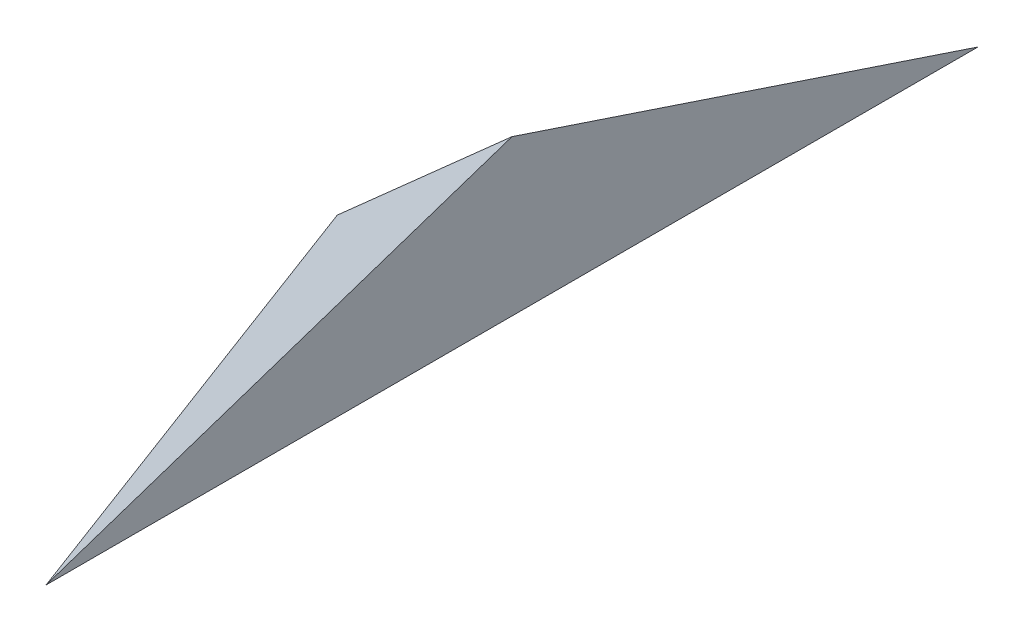
ISO-10303-21;
HEADER;
FILE_DESCRIPTION(('STEP AP214'),'2;1');
FILE_NAME('part.step','',(''),(''),'','','');
FILE_SCHEMA(('AUTOMOTIVE_DESIGN { 1 0 10303 214 1 1 1 1 }'));
ENDSEC;
DATA;
#1=APPLICATION_CONTEXT('core data for automotive mechanical design processes');
#2=APPLICATION_PROTOCOL_DEFINITION('international standard','automotive_design',2000,#1);
#3=PRODUCT_CONTEXT('',#1,'mechanical');
#4=PRODUCT('Part','Part','',(#3));
#5=PRODUCT_RELATED_PRODUCT_CATEGORY('part','',(#4));
#6=PRODUCT_DEFINITION_FORMATION('','',#4);
#7=PRODUCT_DEFINITION_CONTEXT('part definition',#1,'design');
#8=PRODUCT_DEFINITION('design','',#6,#7);
#9=PRODUCT_DEFINITION_SHAPE('','',#8);
#10=(LENGTH_UNIT() NAMED_UNIT(*) SI_UNIT(.MILLI.,.METRE.));
#11=(NAMED_UNIT(*) PLANE_ANGLE_UNIT() SI_UNIT($,.RADIAN.));
#12=(NAMED_UNIT(*) SI_UNIT($,.STERADIAN.) SOLID_ANGLE_UNIT());
#13=UNCERTAINTY_MEASURE_WITH_UNIT(LENGTH_MEASURE(1.E-05),#10,'distance_accuracy_value','');
#14=(GEOMETRIC_REPRESENTATION_CONTEXT(3) GLOBAL_UNCERTAINTY_ASSIGNED_CONTEXT((#13)) GLOBAL_UNIT_ASSIGNED_CONTEXT((#10,
#11,#12)) REPRESENTATION_CONTEXT('',''));
#15=CARTESIAN_POINT('',(0.,0.,0.));
#16=DIRECTION('',(0.,0.,1.));
#17=DIRECTION('',(1.,0.,0.));
#18=AXIS2_PLACEMENT_3D('',#15,#16,#17);
#19=CARTESIAN_POINT('',(0.,40.,0.));
#20=DIRECTION('',(-0.644658371220304,0.725240667622842,0.241746889207614));
#21=DIRECTION('',(-0.74740931868366,-0.66436383882992,0.));
#22=AXIS2_PLACEMENT_3D('',#19,#20,#21);
#23=PLANE('',#22);
#24=DIRECTION('',(-0.74740931868366,-0.66436383882992,0.));
#25=VECTOR('',#24,1.);
#26=CARTESIAN_POINT('',(0.,40.,0.));
#27=LINE('',#26,#25);
#28=CARTESIAN_POINT('',(0.,40.,0.));
#29=VERTEX_POINT('',#28);
#30=CARTESIAN_POINT('',(-45.,0.,0.));
#31=VERTEX_POINT('',#30);
#32=EDGE_CURVE('E121',#29,#31,#27,.T.);
#33=ORIENTED_EDGE('',*,*,#32,.T.);
#34=CARTESIAN_POINT('',(-45.,0.,0.));
#35=CARTESIAN_POINT('',(-30.,0.,40.));
#36=CARTESIAN_POINT('',(-15.,0.,80.));
#37=CARTESIAN_POINT('',(0.,0.,120.));
#38=B_SPLINE_CURVE_WITH_KNOTS('',3,(#34,#35,#36,#37),.UNSPECIFIED.,.F.,.F.,(4,4),(0.,1.),.UNSPECIFIED.);
#39=CARTESIAN_POINT('',(0.,0.,120.));
#40=VERTEX_POINT('',#39);
#41=EDGE_CURVE('E13',#31,#40,#38,.T.);
#42=ORIENTED_EDGE('',*,*,#41,.T.);
#43=CARTESIAN_POINT('',(0.,40.,0.));
#44=CARTESIAN_POINT('',(0.,26.6666666666667,40.));
#45=CARTESIAN_POINT('',(0.,13.3333333333333,80.));
#46=CARTESIAN_POINT('',(0.,0.,120.));
#47=B_SPLINE_CURVE_WITH_KNOTS('',3,(#43,#44,#45,#46),.UNSPECIFIED.,.F.,.F.,(4,4),(0.,1.),.UNSPECIFIED.);
#48=EDGE_CURVE('E127',#29,#40,#47,.T.);
#49=ORIENTED_EDGE('',*,*,#48,.F.);
#50=EDGE_LOOP('',(#33,#42,#49));
#51=FACE_BOUND('',#50,.T.);
#52=ADVANCED_FACE('F117',(#51),#23,.T.);
#53=CARTESIAN_POINT('',(0.,0.,0.));
#54=DIRECTION('',(1.,0.,0.));
#55=DIRECTION('',(0.,1.,0.));
#56=AXIS2_PLACEMENT_3D('',#53,#54,#55);
#57=PLANE('',#56);
#58=CARTESIAN_POINT('',(0.,0.,0.));
#59=CARTESIAN_POINT('',(0.,0.,40.));
#60=CARTESIAN_POINT('',(0.,0.,80.));
#61=CARTESIAN_POINT('',(0.,0.,120.));
#62=B_SPLINE_CURVE_WITH_KNOTS('',3,(#58,#59,#60,#61),.UNSPECIFIED.,.F.,.F.,(4,4),(0.,1.),.UNSPECIFIED.);
#63=CARTESIAN_POINT('',(0.,0.,0.));
#64=VERTEX_POINT('',#63);
#65=EDGE_CURVE('E160',#64,#40,#62,.T.);
#66=ORIENTED_EDGE('',*,*,#65,.F.);
#67=CARTESIAN_POINT('',(0.,0.,0.));
#68=CARTESIAN_POINT('',(0.,0.,-40.));
#69=CARTESIAN_POINT('',(0.,0.,-80.));
#70=CARTESIAN_POINT('',(0.,0.,-120.));
#71=B_SPLINE_CURVE_WITH_KNOTS('',3,(#67,#68,#69,#70),.UNSPECIFIED.,.F.,.F.,(4,4),(0.,1.),.UNSPECIFIED.);
#72=CARTESIAN_POINT('',(0.,0.,-120.));
#73=VERTEX_POINT('',#72);
#74=EDGE_CURVE('E141',#64,#73,#71,.T.);
#75=ORIENTED_EDGE('',*,*,#74,.T.);
#76=CARTESIAN_POINT('',(0.,40.,0.));
#77=CARTESIAN_POINT('',(0.,26.6666666666667,-40.));
#78=CARTESIAN_POINT('',(0.,13.3333333333333,-80.));
#79=CARTESIAN_POINT('',(0.,0.,-120.));
#80=B_SPLINE_CURVE_WITH_KNOTS('',3,(#76,#77,#78,#79),.UNSPECIFIED.,.F.,.F.,(4,4),(0.,1.),.UNSPECIFIED.);
#81=EDGE_CURVE('E155',#29,#73,#80,.T.);
#82=ORIENTED_EDGE('',*,*,#81,.F.);
#83=ORIENTED_EDGE('',*,*,#48,.T.);
#84=EDGE_LOOP('',(#66,#75,#82,#83));
#85=FACE_BOUND('',#84,.T.);
#86=ADVANCED_FACE('F200',(#85),#57,.T.);
#87=CARTESIAN_POINT('',(-45.,0.,0.));
#88=DIRECTION('',(0.,-1.,0.));
#89=DIRECTION('',(1.,0.,0.));
#90=AXIS2_PLACEMENT_3D('',#87,#88,#89);
#91=PLANE('',#90);
#92=ORIENTED_EDGE('',*,*,#41,.F.);
#93=CARTESIAN_POINT('',(-45.,0.,0.));
#94=CARTESIAN_POINT('',(-30.,0.,-40.));
#95=CARTESIAN_POINT('',(-15.,0.,-80.));
#96=CARTESIAN_POINT('',(0.,0.,-120.));
#97=B_SPLINE_CURVE_WITH_KNOTS('',3,(#93,#94,#95,#96),.UNSPECIFIED.,.F.,.F.,(4,4),(0.,1.),.UNSPECIFIED.);
#98=EDGE_CURVE('E151',#31,#73,#97,.T.);
#99=ORIENTED_EDGE('',*,*,#98,.T.);
#100=ORIENTED_EDGE('',*,*,#74,.F.);
#101=ORIENTED_EDGE('',*,*,#65,.T.);
#102=EDGE_LOOP('',(#92,#99,#100,#101));
#103=FACE_BOUND('',#102,.T.);
#104=ADVANCED_FACE('F119',(#103),#91,.T.);
#105=CARTESIAN_POINT('',(0.,40.,0.));
#106=DIRECTION('',(-0.644658371220304,0.725240667622842,-0.241746889207614));
#107=DIRECTION('',(-0.74740931868366,-0.66436383882992,0.));
#108=AXIS2_PLACEMENT_3D('',#105,#106,#107);
#109=PLANE('',#108);
#110=ORIENTED_EDGE('',*,*,#32,.F.);
#111=ORIENTED_EDGE('',*,*,#81,.T.);
#112=ORIENTED_EDGE('',*,*,#98,.F.);
#113=EDGE_LOOP('',(#110,#111,#112));
#114=FACE_BOUND('',#113,.T.);
#115=ADVANCED_FACE('F153',(#114),#109,.T.);
#116=CLOSED_SHELL('',(#52,#86,#104,#115));
#117=MANIFOLD_SOLID_BREP('B2',#116);
#118=ADVANCED_BREP_SHAPE_REPRESENTATION('',(#18,#117),#14);
#119=SHAPE_DEFINITION_REPRESENTATION(#9,#118);
ENDSEC;
END-ISO-10303-21;
